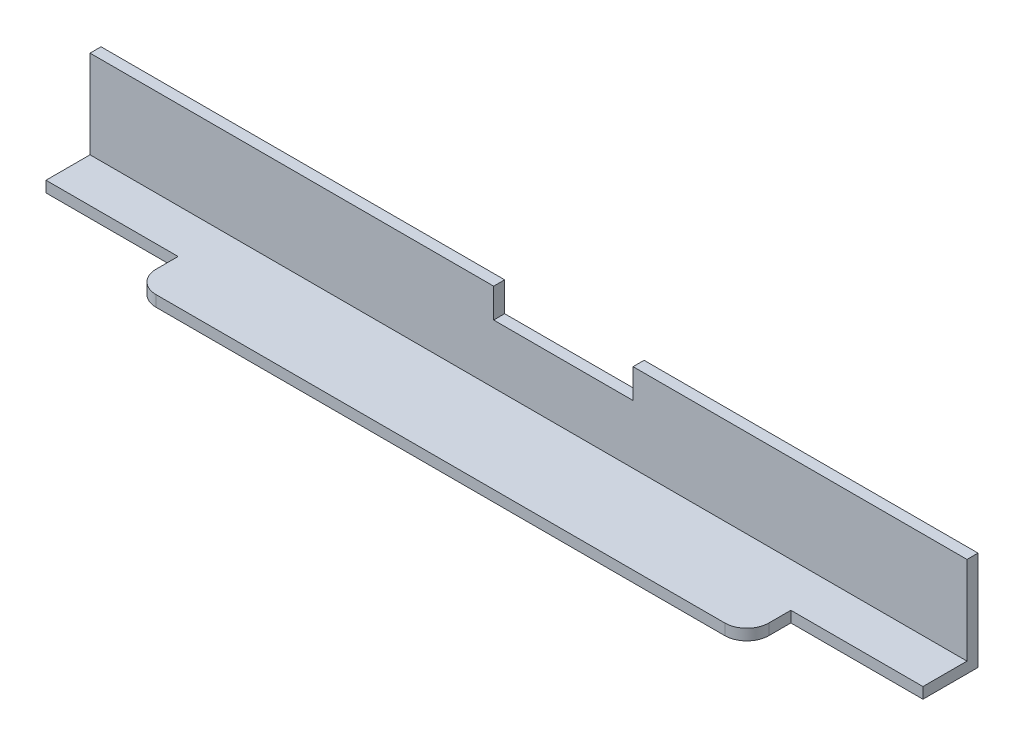
ISO-10303-21;
HEADER;
FILE_DESCRIPTION(('STEP AP214'),'2;1');
FILE_NAME('part.step','',(''),(''),'','','');
FILE_SCHEMA(('AUTOMOTIVE_DESIGN { 1 0 10303 214 1 1 1 1 }'));
ENDSEC;
DATA;
#1=APPLICATION_CONTEXT('core data for automotive mechanical design processes');
#2=APPLICATION_PROTOCOL_DEFINITION('international standard','automotive_design',2000,#1);
#3=PRODUCT_CONTEXT('',#1,'mechanical');
#4=PRODUCT('Part','Part','',(#3));
#5=PRODUCT_RELATED_PRODUCT_CATEGORY('part','',(#4));
#6=PRODUCT_DEFINITION_FORMATION('','',#4);
#7=PRODUCT_DEFINITION_CONTEXT('part definition',#1,'design');
#8=PRODUCT_DEFINITION('design','',#6,#7);
#9=PRODUCT_DEFINITION_SHAPE('','',#8);
#10=(LENGTH_UNIT() NAMED_UNIT(*) SI_UNIT(.MILLI.,.METRE.));
#11=(NAMED_UNIT(*) PLANE_ANGLE_UNIT() SI_UNIT($,.RADIAN.));
#12=(NAMED_UNIT(*) SI_UNIT($,.STERADIAN.) SOLID_ANGLE_UNIT());
#13=UNCERTAINTY_MEASURE_WITH_UNIT(LENGTH_MEASURE(1.E-05),#10,'distance_accuracy_value','');
#14=(GEOMETRIC_REPRESENTATION_CONTEXT(3) GLOBAL_UNCERTAINTY_ASSIGNED_CONTEXT((#13)) GLOBAL_UNIT_ASSIGNED_CONTEXT((#10,
#11,#12)) REPRESENTATION_CONTEXT('',''));
#15=CARTESIAN_POINT('',(0.,0.,0.));
#16=DIRECTION('',(0.,0.,1.));
#17=DIRECTION('',(1.,0.,0.));
#18=AXIS2_PLACEMENT_3D('',#15,#16,#17);
#19=CARTESIAN_POINT('',(0.,0.,3.));
#20=DIRECTION('',(0.,-1.,0.));
#21=DIRECTION('',(0.,0.,-1.));
#22=AXIS2_PLACEMENT_3D('',#19,#20,#21);
#23=PLANE('',#22);
#24=DIRECTION('',(-1.,0.,0.));
#25=VECTOR('',#24,1.);
#26=CARTESIAN_POINT('',(0.,0.,0.));
#27=LINE('',#26,#25);
#28=CARTESIAN_POINT('',(0.,0.,0.));
#29=VERTEX_POINT('',#28);
#30=CARTESIAN_POINT('',(-91.,0.,0.));
#31=VERTEX_POINT('',#30);
#32=EDGE_CURVE('E299',#29,#31,#27,.T.);
#33=ORIENTED_EDGE('',*,*,#32,.T.);
#34=DIRECTION('',(0.,0.,-1.));
#35=VECTOR('',#34,1.);
#36=CARTESIAN_POINT('',(-91.,0.,3.));
#37=LINE('',#36,#35);
#38=CARTESIAN_POINT('',(-91.,0.,3.));
#39=VERTEX_POINT('',#38);
#40=EDGE_CURVE('E190',#39,#31,#37,.T.);
#41=ORIENTED_EDGE('',*,*,#40,.F.);
#42=DIRECTION('',(-1.,0.,0.));
#43=VECTOR('',#42,1.);
#44=CARTESIAN_POINT('',(0.,0.,3.));
#45=LINE('',#44,#43);
#46=CARTESIAN_POINT('',(0.,0.,3.));
#47=VERTEX_POINT('',#46);
#48=EDGE_CURVE('E176',#47,#39,#45,.T.);
#49=ORIENTED_EDGE('',*,*,#48,.F.);
#50=DIRECTION('',(0.,0.,-1.));
#51=VECTOR('',#50,1.);
#52=CARTESIAN_POINT('',(0.,0.,3.));
#53=LINE('',#52,#51);
#54=EDGE_CURVE('E11',#47,#29,#53,.T.);
#55=ORIENTED_EDGE('',*,*,#54,.T.);
#56=EDGE_LOOP('',(#33,#41,#49,#55));
#57=FACE_BOUND('',#56,.T.);
#58=ADVANCED_FACE('F41',(#57),#23,.F.);
#59=CARTESIAN_POINT('',(0.,0.,15.));
#60=DIRECTION('',(0.,0.,-1.));
#61=DIRECTION('',(-1.,0.,0.));
#62=AXIS2_PLACEMENT_3D('',#59,#60,#61);
#63=PLANE('',#62);
#64=DIRECTION('',(0.,1.,0.));
#65=VECTOR('',#64,1.);
#66=CARTESIAN_POINT('',(-36.,-27.,15.));
#67=LINE('',#66,#65);
#68=CARTESIAN_POINT('',(-36.,-27.,15.));
#69=VERTEX_POINT('',#68);
#70=CARTESIAN_POINT('',(-36.,-24.,15.));
#71=VERTEX_POINT('',#70);
#72=EDGE_CURVE('E241',#69,#71,#67,.T.);
#73=ORIENTED_EDGE('',*,*,#72,.F.);
#74=DIRECTION('',(1.,0.,0.));
#75=VECTOR('',#74,1.);
#76=CARTESIAN_POINT('',(-239.,-27.,15.));
#77=LINE('',#76,#75);
#78=CARTESIAN_POINT('',(0.,-27.,15.));
#79=VERTEX_POINT('',#78);
#80=EDGE_CURVE('E259',#69,#79,#77,.T.);
#81=ORIENTED_EDGE('',*,*,#80,.T.);
#82=DIRECTION('',(0.,1.,0.));
#83=VECTOR('',#82,1.);
#84=CARTESIAN_POINT('',(0.,-27.,15.));
#85=LINE('',#84,#83);
#86=CARTESIAN_POINT('',(0.,-24.,15.));
#87=VERTEX_POINT('',#86);
#88=EDGE_CURVE('E264',#79,#87,#85,.T.);
#89=ORIENTED_EDGE('',*,*,#88,.T.);
#90=DIRECTION('',(-1.,0.,0.));
#91=VECTOR('',#90,1.);
#92=CARTESIAN_POINT('',(-239.,-24.,15.));
#93=LINE('',#92,#91);
#94=EDGE_CURVE('E268',#87,#71,#93,.T.);
#95=ORIENTED_EDGE('',*,*,#94,.T.);
#96=EDGE_LOOP('',(#73,#81,#89,#95));
#97=FACE_BOUND('',#96,.T.);
#98=ADVANCED_FACE('F342',(#97),#63,.F.);
#99=CARTESIAN_POINT('',(0.,0.,3.));
#100=DIRECTION('',(0.,0.,-1.));
#101=DIRECTION('',(-1.,0.,0.));
#102=AXIS2_PLACEMENT_3D('',#99,#100,#101);
#103=PLANE('',#102);
#104=ORIENTED_EDGE('',*,*,#48,.T.);
#105=DIRECTION('',(0.,-1.,0.));
#106=VECTOR('',#105,1.);
#107=CARTESIAN_POINT('',(-91.,0.,3.));
#108=LINE('',#107,#106);
#109=CARTESIAN_POINT('',(-91.,-8.,3.));
#110=VERTEX_POINT('',#109);
#111=EDGE_CURVE('E156',#39,#110,#108,.T.);
#112=ORIENTED_EDGE('',*,*,#111,.T.);
#113=DIRECTION('',(-1.,0.,0.));
#114=VECTOR('',#113,1.);
#115=CARTESIAN_POINT('',(-91.,-8.,3.));
#116=LINE('',#115,#114);
#117=CARTESIAN_POINT('',(-129.,-8.,3.));
#118=VERTEX_POINT('',#117);
#119=EDGE_CURVE('E166',#110,#118,#116,.T.);
#120=ORIENTED_EDGE('',*,*,#119,.T.);
#121=DIRECTION('',(0.,1.,0.));
#122=VECTOR('',#121,1.);
#123=CARTESIAN_POINT('',(-129.,0.,3.));
#124=LINE('',#123,#122);
#125=CARTESIAN_POINT('',(-129.,0.,3.));
#126=VERTEX_POINT('',#125);
#127=EDGE_CURVE('E163',#118,#126,#124,.T.);
#128=ORIENTED_EDGE('',*,*,#127,.T.);
#129=CARTESIAN_POINT('',(-239.,0.,3.));
#130=VERTEX_POINT('',#129);
#131=EDGE_CURVE('E287',#126,#130,#45,.T.);
#132=ORIENTED_EDGE('',*,*,#131,.T.);
#133=DIRECTION('',(0.,-1.,0.));
#134=VECTOR('',#133,1.);
#135=CARTESIAN_POINT('',(-239.,0.,3.));
#136=LINE('',#135,#134);
#137=CARTESIAN_POINT('',(-239.,-24.,3.));
#138=VERTEX_POINT('',#137);
#139=EDGE_CURVE('E291',#130,#138,#136,.T.);
#140=ORIENTED_EDGE('',*,*,#139,.T.);
#141=DIRECTION('',(-1.,0.,0.));
#142=VECTOR('',#141,1.);
#143=CARTESIAN_POINT('',(-239.,-24.,3.));
#144=LINE('',#143,#142);
#145=CARTESIAN_POINT('',(0.,-24.,3.));
#146=VERTEX_POINT('',#145);
#147=EDGE_CURVE('E240',#146,#138,#144,.T.);
#148=ORIENTED_EDGE('',*,*,#147,.F.);
#149=DIRECTION('',(0.,1.,0.));
#150=VECTOR('',#149,1.);
#151=CARTESIAN_POINT('',(0.,0.,3.));
#152=LINE('',#151,#150);
#153=EDGE_CURVE('E284',#146,#47,#152,.T.);
#154=ORIENTED_EDGE('',*,*,#153,.T.);
#155=EDGE_LOOP('',(#104,#112,#120,#128,#132,#140,#148,#154));
#156=FACE_BOUND('',#155,.T.);
#157=ADVANCED_FACE('F174',(#156),#103,.F.);
#158=CARTESIAN_POINT('',(0.,0.,3.));
#159=DIRECTION('',(-1.,0.,0.));
#160=DIRECTION('',(0.,-1.,0.));
#161=AXIS2_PLACEMENT_3D('',#158,#159,#160);
#162=PLANE('',#161);
#163=DIRECTION('',(0.,1.,0.));
#164=VECTOR('',#163,1.);
#165=CARTESIAN_POINT('',(0.,0.,0.));
#166=LINE('',#165,#164);
#167=CARTESIAN_POINT('',(0.,-27.,0.));
#168=VERTEX_POINT('',#167);
#169=EDGE_CURVE('E283',#168,#29,#166,.T.);
#170=ORIENTED_EDGE('',*,*,#169,.T.);
#171=ORIENTED_EDGE('',*,*,#54,.F.);
#172=ORIENTED_EDGE('',*,*,#153,.F.);
#173=DIRECTION('',(0.,0.,-1.));
#174=VECTOR('',#173,1.);
#175=CARTESIAN_POINT('',(0.,-24.,15.));
#176=LINE('',#175,#174);
#177=EDGE_CURVE('E279',#87,#146,#176,.T.);
#178=ORIENTED_EDGE('',*,*,#177,.F.);
#179=ORIENTED_EDGE('',*,*,#88,.F.);
#180=DIRECTION('',(0.,0.,-1.));
#181=VECTOR('',#180,1.);
#182=CARTESIAN_POINT('',(0.,-27.,3.));
#183=LINE('',#182,#181);
#184=EDGE_CURVE('E294',#79,#168,#183,.T.);
#185=ORIENTED_EDGE('',*,*,#184,.T.);
#186=EDGE_LOOP('',(#170,#171,#172,#178,#179,#185));
#187=FACE_BOUND('',#186,.T.);
#188=ADVANCED_FACE('F43',(#187),#162,.F.);
#189=ORIENTED_EDGE('',*,*,#131,.F.);
#190=DIRECTION('',(0.,0.,-1.));
#191=VECTOR('',#190,1.);
#192=CARTESIAN_POINT('',(-129.,0.,3.));
#193=LINE('',#192,#191);
#194=CARTESIAN_POINT('',(-129.,0.,0.));
#195=VERTEX_POINT('',#194);
#196=EDGE_CURVE('E193',#126,#195,#193,.T.);
#197=ORIENTED_EDGE('',*,*,#196,.T.);
#198=CARTESIAN_POINT('',(-239.,0.,0.));
#199=VERTEX_POINT('',#198);
#200=EDGE_CURVE('E298',#195,#199,#27,.T.);
#201=ORIENTED_EDGE('',*,*,#200,.T.);
#202=DIRECTION('',(0.,0.,-1.));
#203=VECTOR('',#202,1.);
#204=CARTESIAN_POINT('',(-239.,0.,3.));
#205=LINE('',#204,#203);
#206=EDGE_CURVE('E50',#130,#199,#205,.T.);
#207=ORIENTED_EDGE('',*,*,#206,.F.);
#208=EDGE_LOOP('',(#189,#197,#201,#207));
#209=FACE_BOUND('',#208,.T.);
#210=ADVANCED_FACE('F348',(#209),#23,.F.);
#211=CARTESIAN_POINT('',(-239.,0.,3.));
#212=DIRECTION('',(1.,0.,0.));
#213=DIRECTION('',(0.,0.,-1.));
#214=AXIS2_PLACEMENT_3D('',#211,#212,#213);
#215=PLANE('',#214);
#216=DIRECTION('',(0.,-1.,0.));
#217=VECTOR('',#216,1.);
#218=CARTESIAN_POINT('',(-239.,0.,0.));
#219=LINE('',#218,#217);
#220=CARTESIAN_POINT('',(-239.,-27.,0.));
#221=VERTEX_POINT('',#220);
#222=EDGE_CURVE('E303',#199,#221,#219,.T.);
#223=ORIENTED_EDGE('',*,*,#222,.T.);
#224=DIRECTION('',(0.,0.,-1.));
#225=VECTOR('',#224,1.);
#226=CARTESIAN_POINT('',(-239.,-27.,3.));
#227=LINE('',#226,#225);
#228=CARTESIAN_POINT('',(-239.,-27.,15.));
#229=VERTEX_POINT('',#228);
#230=EDGE_CURVE('E311',#229,#221,#227,.T.);
#231=ORIENTED_EDGE('',*,*,#230,.F.);
#232=DIRECTION('',(0.,-1.,0.));
#233=VECTOR('',#232,1.);
#234=CARTESIAN_POINT('',(-239.,-27.,15.));
#235=LINE('',#234,#233);
#236=CARTESIAN_POINT('',(-239.,-24.,15.));
#237=VERTEX_POINT('',#236);
#238=EDGE_CURVE('E255',#237,#229,#235,.T.);
#239=ORIENTED_EDGE('',*,*,#238,.F.);
#240=DIRECTION('',(0.,0.,-1.));
#241=VECTOR('',#240,1.);
#242=CARTESIAN_POINT('',(-239.,-24.,15.));
#243=LINE('',#242,#241);
#244=EDGE_CURVE('E272',#237,#138,#243,.T.);
#245=ORIENTED_EDGE('',*,*,#244,.T.);
#246=ORIENTED_EDGE('',*,*,#139,.F.);
#247=ORIENTED_EDGE('',*,*,#206,.T.);
#248=EDGE_LOOP('',(#223,#231,#239,#245,#246,#247));
#249=FACE_BOUND('',#248,.T.);
#250=ADVANCED_FACE('F320',(#249),#215,.F.);
#251=CARTESIAN_POINT('',(0.,-27.,3.));
#252=DIRECTION('',(0.,1.,0.));
#253=DIRECTION('',(-1.,0.,0.));
#254=AXIS2_PLACEMENT_3D('',#251,#252,#253);
#255=PLANE('',#254);
#256=DIRECTION('',(1.,0.,0.));
#257=VECTOR('',#256,1.);
#258=CARTESIAN_POINT('',(0.,-27.,0.));
#259=LINE('',#258,#257);
#260=EDGE_CURVE('E288',#221,#168,#259,.T.);
#261=ORIENTED_EDGE('',*,*,#260,.T.);
#262=ORIENTED_EDGE('',*,*,#184,.F.);
#263=ORIENTED_EDGE('',*,*,#80,.F.);
#264=DIRECTION('',(0.,0.,-1.));
#265=VECTOR('',#264,1.);
#266=CARTESIAN_POINT('',(-36.,-27.,15.));
#267=LINE('',#266,#265);
#268=CARTESIAN_POINT('',(-36.,-27.,21.));
#269=VERTEX_POINT('',#268);
#270=EDGE_CURVE('E216',#269,#69,#267,.T.);
#271=ORIENTED_EDGE('',*,*,#270,.F.);
#272=CARTESIAN_POINT('',(-42.,-27.,21.));
#273=DIRECTION('',(0.,1.,0.));
#274=DIRECTION('',(0.,0.,1.));
#275=AXIS2_PLACEMENT_3D('',#272,#273,#274);
#276=CIRCLE('',#275,6.);
#277=CARTESIAN_POINT('',(-42.,-27.,27.));
#278=VERTEX_POINT('',#277);
#279=EDGE_CURVE('E212',#278,#269,#276,.T.);
#280=ORIENTED_EDGE('',*,*,#279,.F.);
#281=DIRECTION('',(1.,0.,0.));
#282=VECTOR('',#281,1.);
#283=CARTESIAN_POINT('',(-197.,-27.,27.));
#284=LINE('',#283,#282);
#285=CARTESIAN_POINT('',(-197.,-27.,27.));
#286=VERTEX_POINT('',#285);
#287=EDGE_CURVE('E208',#286,#278,#284,.T.);
#288=ORIENTED_EDGE('',*,*,#287,.F.);
#289=CARTESIAN_POINT('',(-197.,-27.,21.));
#290=DIRECTION('',(0.,1.,0.));
#291=DIRECTION('',(0.,0.,1.));
#292=AXIS2_PLACEMENT_3D('',#289,#290,#291);
#293=CIRCLE('',#292,6.);
#294=CARTESIAN_POINT('',(-203.,-27.,21.));
#295=VERTEX_POINT('',#294);
#296=EDGE_CURVE('E203',#295,#286,#293,.T.);
#297=ORIENTED_EDGE('',*,*,#296,.F.);
#298=DIRECTION('',(0.,0.,1.));
#299=VECTOR('',#298,1.);
#300=CARTESIAN_POINT('',(-203.,-27.,15.));
#301=LINE('',#300,#299);
#302=CARTESIAN_POINT('',(-203.,-27.,15.));
#303=VERTEX_POINT('',#302);
#304=EDGE_CURVE('E199',#303,#295,#301,.T.);
#305=ORIENTED_EDGE('',*,*,#304,.F.);
#306=EDGE_CURVE('E260',#229,#303,#77,.T.);
#307=ORIENTED_EDGE('',*,*,#306,.F.);
#308=ORIENTED_EDGE('',*,*,#230,.T.);
#309=EDGE_LOOP('',(#261,#262,#263,#271,#280,#288,#297,#305,#307,#308));
#310=FACE_BOUND('',#309,.T.);
#311=ADVANCED_FACE('F331',(#310),#255,.F.);
#312=CARTESIAN_POINT('',(0.,0.,0.));
#313=DIRECTION('',(0.,0.,-1.));
#314=DIRECTION('',(-1.,0.,0.));
#315=AXIS2_PLACEMENT_3D('',#312,#313,#314);
#316=PLANE('',#315);
#317=DIRECTION('',(0.,-1.,0.));
#318=VECTOR('',#317,1.);
#319=CARTESIAN_POINT('',(-91.,0.,0.));
#320=LINE('',#319,#318);
#321=CARTESIAN_POINT('',(-91.,-8.,0.));
#322=VERTEX_POINT('',#321);
#323=EDGE_CURVE('E57',#31,#322,#320,.T.);
#324=ORIENTED_EDGE('',*,*,#323,.F.);
#325=ORIENTED_EDGE('',*,*,#32,.F.);
#326=ORIENTED_EDGE('',*,*,#169,.F.);
#327=ORIENTED_EDGE('',*,*,#260,.F.);
#328=ORIENTED_EDGE('',*,*,#222,.F.);
#329=ORIENTED_EDGE('',*,*,#200,.F.);
#330=DIRECTION('',(0.,1.,0.));
#331=VECTOR('',#330,1.);
#332=CARTESIAN_POINT('',(-129.,0.,0.));
#333=LINE('',#332,#331);
#334=CARTESIAN_POINT('',(-129.,-8.,0.));
#335=VERTEX_POINT('',#334);
#336=EDGE_CURVE('E178',#335,#195,#333,.T.);
#337=ORIENTED_EDGE('',*,*,#336,.F.);
#338=DIRECTION('',(-1.,0.,0.));
#339=VECTOR('',#338,1.);
#340=CARTESIAN_POINT('',(-91.,-8.,0.));
#341=LINE('',#340,#339);
#342=EDGE_CURVE('E181',#322,#335,#341,.T.);
#343=ORIENTED_EDGE('',*,*,#342,.F.);
#344=EDGE_LOOP('',(#324,#325,#326,#327,#328,#329,#337,#343));
#345=FACE_BOUND('',#344,.T.);
#346=ADVANCED_FACE('F326',(#345),#316,.T.);
#347=CARTESIAN_POINT('',(-239.,-24.,15.));
#348=DIRECTION('',(0.,-1.,0.));
#349=DIRECTION('',(0.,0.,-1.));
#350=AXIS2_PLACEMENT_3D('',#347,#348,#349);
#351=PLANE('',#350);
#352=ORIENTED_EDGE('',*,*,#147,.T.);
#353=ORIENTED_EDGE('',*,*,#244,.F.);
#354=CARTESIAN_POINT('',(-203.,-24.,15.));
#355=VERTEX_POINT('',#354);
#356=EDGE_CURVE('E267',#355,#237,#93,.T.);
#357=ORIENTED_EDGE('',*,*,#356,.F.);
#358=DIRECTION('',(0.,0.,1.));
#359=VECTOR('',#358,1.);
#360=CARTESIAN_POINT('',(-203.,-24.,15.));
#361=LINE('',#360,#359);
#362=CARTESIAN_POINT('',(-203.,-24.,21.));
#363=VERTEX_POINT('',#362);
#364=EDGE_CURVE('E65',#355,#363,#361,.T.);
#365=ORIENTED_EDGE('',*,*,#364,.T.);
#366=CARTESIAN_POINT('',(-197.,-24.,21.));
#367=DIRECTION('',(0.,1.,0.));
#368=DIRECTION('',(0.,0.,1.));
#369=AXIS2_PLACEMENT_3D('',#366,#367,#368);
#370=CIRCLE('',#369,6.);
#371=CARTESIAN_POINT('',(-197.,-24.,27.));
#372=VERTEX_POINT('',#371);
#373=EDGE_CURVE('E222',#363,#372,#370,.T.);
#374=ORIENTED_EDGE('',*,*,#373,.T.);
#375=DIRECTION('',(1.,0.,0.));
#376=VECTOR('',#375,1.);
#377=CARTESIAN_POINT('',(-197.,-24.,27.));
#378=LINE('',#377,#376);
#379=CARTESIAN_POINT('',(-42.,-24.,27.));
#380=VERTEX_POINT('',#379);
#381=EDGE_CURVE('E226',#372,#380,#378,.T.);
#382=ORIENTED_EDGE('',*,*,#381,.T.);
#383=CARTESIAN_POINT('',(-42.,-24.,21.));
#384=DIRECTION('',(0.,1.,0.));
#385=DIRECTION('',(0.,0.,1.));
#386=AXIS2_PLACEMENT_3D('',#383,#384,#385);
#387=CIRCLE('',#386,6.);
#388=CARTESIAN_POINT('',(-36.,-24.,21.));
#389=VERTEX_POINT('',#388);
#390=EDGE_CURVE('E230',#380,#389,#387,.T.);
#391=ORIENTED_EDGE('',*,*,#390,.T.);
#392=DIRECTION('',(0.,0.,-1.));
#393=VECTOR('',#392,1.);
#394=CARTESIAN_POINT('',(-36.,-24.,15.));
#395=LINE('',#394,#393);
#396=EDGE_CURVE('E204',#389,#71,#395,.T.);
#397=ORIENTED_EDGE('',*,*,#396,.T.);
#398=ORIENTED_EDGE('',*,*,#94,.F.);
#399=ORIENTED_EDGE('',*,*,#177,.T.);
#400=EDGE_LOOP('',(#352,#353,#357,#365,#374,#382,#391,#397,#398,#399));
#401=FACE_BOUND('',#400,.T.);
#402=ADVANCED_FACE('F353',(#401),#351,.F.);
#403=ORIENTED_EDGE('',*,*,#306,.T.);
#404=DIRECTION('',(0.,1.,0.));
#405=VECTOR('',#404,1.);
#406=CARTESIAN_POINT('',(-203.,-27.,15.));
#407=LINE('',#406,#405);
#408=EDGE_CURVE('E237',#303,#355,#407,.T.);
#409=ORIENTED_EDGE('',*,*,#408,.T.);
#410=ORIENTED_EDGE('',*,*,#356,.T.);
#411=ORIENTED_EDGE('',*,*,#238,.T.);
#412=EDGE_LOOP('',(#403,#409,#410,#411));
#413=FACE_BOUND('',#412,.T.);
#414=ADVANCED_FACE('F373',(#413),#63,.F.);
#415=CARTESIAN_POINT('',(-203.,-27.,15.));
#416=DIRECTION('',(-1.,0.,0.));
#417=DIRECTION('',(0.,0.,1.));
#418=AXIS2_PLACEMENT_3D('',#415,#416,#417);
#419=PLANE('',#418);
#420=ORIENTED_EDGE('',*,*,#364,.F.);
#421=ORIENTED_EDGE('',*,*,#408,.F.);
#422=ORIENTED_EDGE('',*,*,#304,.T.);
#423=DIRECTION('',(0.,1.,0.));
#424=VECTOR('',#423,1.);
#425=CARTESIAN_POINT('',(-203.,-27.,21.));
#426=LINE('',#425,#424);
#427=EDGE_CURVE('E219',#295,#363,#426,.T.);
#428=ORIENTED_EDGE('',*,*,#427,.T.);
#429=EDGE_LOOP('',(#420,#421,#422,#428));
#430=FACE_BOUND('',#429,.T.);
#431=ADVANCED_FACE('F371',(#430),#419,.T.);
#432=CARTESIAN_POINT('',(-36.,-27.,15.));
#433=DIRECTION('',(1.,0.,0.));
#434=DIRECTION('',(0.,0.,-1.));
#435=AXIS2_PLACEMENT_3D('',#432,#433,#434);
#436=PLANE('',#435);
#437=ORIENTED_EDGE('',*,*,#396,.F.);
#438=DIRECTION('',(0.,1.,0.));
#439=VECTOR('',#438,1.);
#440=CARTESIAN_POINT('',(-36.,-27.,21.));
#441=LINE('',#440,#439);
#442=EDGE_CURVE('E244',#269,#389,#441,.T.);
#443=ORIENTED_EDGE('',*,*,#442,.F.);
#444=ORIENTED_EDGE('',*,*,#270,.T.);
#445=ORIENTED_EDGE('',*,*,#72,.T.);
#446=EDGE_LOOP('',(#437,#443,#444,#445));
#447=FACE_BOUND('',#446,.T.);
#448=ADVANCED_FACE('F358',(#447),#436,.T.);
#449=CARTESIAN_POINT('',(-42.,-27.,21.));
#450=DIRECTION('',(0.,1.,0.));
#451=DIRECTION('',(0.,0.,1.));
#452=AXIS2_PLACEMENT_3D('',#449,#450,#451);
#453=CYLINDRICAL_SURFACE('',#452,6.);
#454=ORIENTED_EDGE('',*,*,#390,.F.);
#455=DIRECTION('',(0.,1.,0.));
#456=VECTOR('',#455,1.);
#457=CARTESIAN_POINT('',(-42.,-27.,27.));
#458=LINE('',#457,#456);
#459=EDGE_CURVE('E247',#278,#380,#458,.T.);
#460=ORIENTED_EDGE('',*,*,#459,.F.);
#461=ORIENTED_EDGE('',*,*,#279,.T.);
#462=ORIENTED_EDGE('',*,*,#442,.T.);
#463=EDGE_LOOP('',(#454,#460,#461,#462));
#464=FACE_BOUND('',#463,.T.);
#465=ADVANCED_FACE('F362',(#464),#453,.T.);
#466=CARTESIAN_POINT('',(-197.,-27.,27.));
#467=DIRECTION('',(0.,0.,1.));
#468=DIRECTION('',(1.,0.,0.));
#469=AXIS2_PLACEMENT_3D('',#466,#467,#468);
#470=PLANE('',#469);
#471=ORIENTED_EDGE('',*,*,#381,.F.);
#472=DIRECTION('',(0.,1.,0.));
#473=VECTOR('',#472,1.);
#474=CARTESIAN_POINT('',(-197.,-27.,27.));
#475=LINE('',#474,#473);
#476=EDGE_CURVE('E250',#286,#372,#475,.T.);
#477=ORIENTED_EDGE('',*,*,#476,.F.);
#478=ORIENTED_EDGE('',*,*,#287,.T.);
#479=ORIENTED_EDGE('',*,*,#459,.T.);
#480=EDGE_LOOP('',(#471,#477,#478,#479));
#481=FACE_BOUND('',#480,.T.);
#482=ADVANCED_FACE('F365',(#481),#470,.T.);
#483=CARTESIAN_POINT('',(-197.,-27.,21.));
#484=DIRECTION('',(0.,1.,0.));
#485=DIRECTION('',(0.,0.,1.));
#486=AXIS2_PLACEMENT_3D('',#483,#484,#485);
#487=CYLINDRICAL_SURFACE('',#486,6.);
#488=ORIENTED_EDGE('',*,*,#373,.F.);
#489=ORIENTED_EDGE('',*,*,#427,.F.);
#490=ORIENTED_EDGE('',*,*,#296,.T.);
#491=ORIENTED_EDGE('',*,*,#476,.T.);
#492=EDGE_LOOP('',(#488,#489,#490,#491));
#493=FACE_BOUND('',#492,.T.);
#494=ADVANCED_FACE('F370',(#493),#487,.T.);
#495=CARTESIAN_POINT('',(-91.,0.,3.));
#496=DIRECTION('',(1.,0.,0.));
#497=DIRECTION('',(0.,0.,-1.));
#498=AXIS2_PLACEMENT_3D('',#495,#496,#497);
#499=PLANE('',#498);
#500=ORIENTED_EDGE('',*,*,#323,.T.);
#501=DIRECTION('',(0.,0.,-1.));
#502=VECTOR('',#501,1.);
#503=CARTESIAN_POINT('',(-91.,-8.,3.));
#504=LINE('',#503,#502);
#505=EDGE_CURVE('E152',#110,#322,#504,.T.);
#506=ORIENTED_EDGE('',*,*,#505,.F.);
#507=ORIENTED_EDGE('',*,*,#111,.F.);
#508=ORIENTED_EDGE('',*,*,#40,.T.);
#509=EDGE_LOOP('',(#500,#506,#507,#508));
#510=FACE_BOUND('',#509,.T.);
#511=ADVANCED_FACE('F154',(#510),#499,.F.);
#512=CARTESIAN_POINT('',(-129.,0.,3.));
#513=DIRECTION('',(-1.,0.,0.));
#514=DIRECTION('',(0.,0.,1.));
#515=AXIS2_PLACEMENT_3D('',#512,#513,#514);
#516=PLANE('',#515);
#517=ORIENTED_EDGE('',*,*,#336,.T.);
#518=ORIENTED_EDGE('',*,*,#196,.F.);
#519=ORIENTED_EDGE('',*,*,#127,.F.);
#520=DIRECTION('',(0.,0.,-1.));
#521=VECTOR('',#520,1.);
#522=CARTESIAN_POINT('',(-129.,-8.,3.));
#523=LINE('',#522,#521);
#524=EDGE_CURVE('E162',#118,#335,#523,.T.);
#525=ORIENTED_EDGE('',*,*,#524,.T.);
#526=EDGE_LOOP('',(#517,#518,#519,#525));
#527=FACE_BOUND('',#526,.T.);
#528=ADVANCED_FACE('F350',(#527),#516,.F.);
#529=CARTESIAN_POINT('',(-91.,-8.,3.));
#530=DIRECTION('',(0.,-1.,0.));
#531=DIRECTION('',(0.,0.,-1.));
#532=AXIS2_PLACEMENT_3D('',#529,#530,#531);
#533=PLANE('',#532);
#534=ORIENTED_EDGE('',*,*,#342,.T.);
#535=ORIENTED_EDGE('',*,*,#524,.F.);
#536=ORIENTED_EDGE('',*,*,#119,.F.);
#537=ORIENTED_EDGE('',*,*,#505,.T.);
#538=EDGE_LOOP('',(#534,#535,#536,#537));
#539=FACE_BOUND('',#538,.T.);
#540=ADVANCED_FACE('F167',(#539),#533,.F.);
#541=CLOSED_SHELL('',(#58,#98,#157,#188,#210,#250,#311,#346,#402,#414,#431,#448,#465,#482,#494,
#511,#528,#540));
#542=MANIFOLD_SOLID_BREP('B2',#541);
#543=ADVANCED_BREP_SHAPE_REPRESENTATION('',(#18,#542),#14);
#544=SHAPE_DEFINITION_REPRESENTATION(#9,#543);
ENDSEC;
END-ISO-10303-21;
